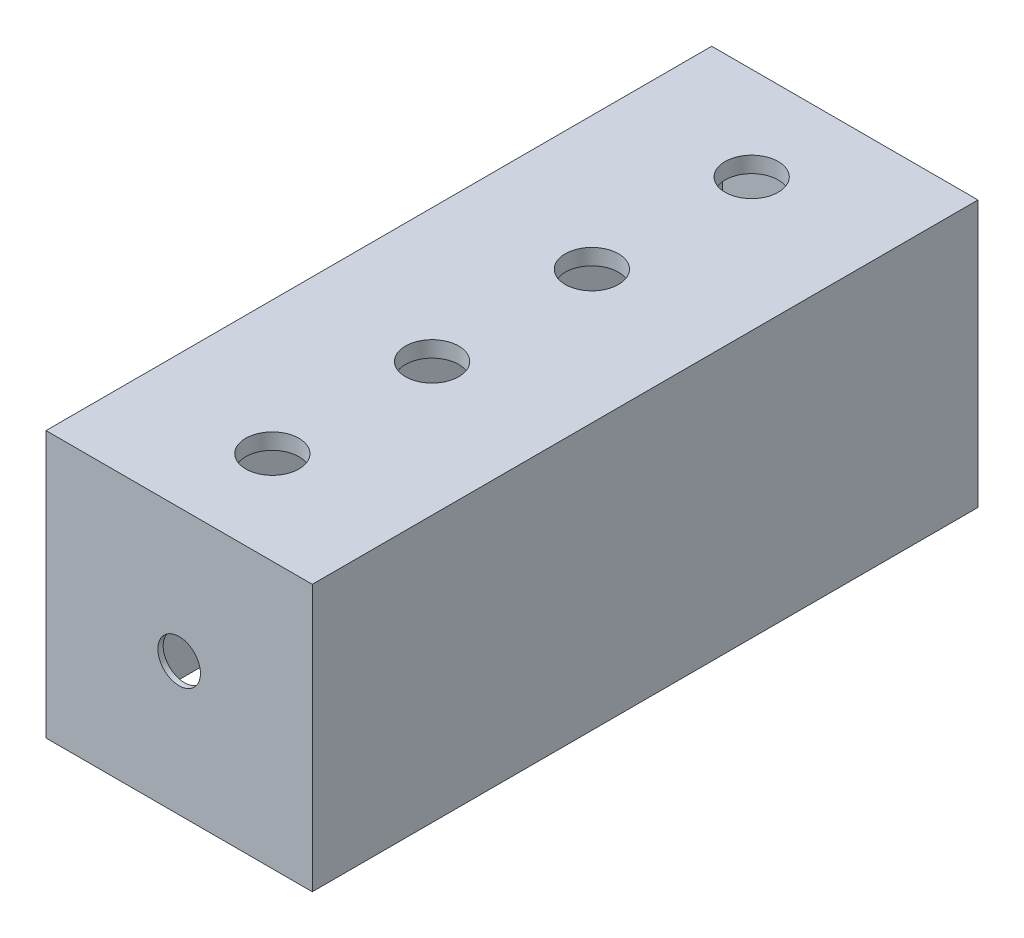
ISO-10303-21;
HEADER;
FILE_DESCRIPTION(('STEP AP214'),'2;1');
FILE_NAME('part.step','',(''),(''),'','','');
FILE_SCHEMA(('AUTOMOTIVE_DESIGN { 1 0 10303 214 1 1 1 1 }'));
ENDSEC;
DATA;
#1=APPLICATION_CONTEXT('core data for automotive mechanical design processes');
#2=APPLICATION_PROTOCOL_DEFINITION('international standard','automotive_design',2000,#1);
#3=PRODUCT_CONTEXT('',#1,'mechanical');
#4=PRODUCT('Part','Part','',(#3));
#5=PRODUCT_RELATED_PRODUCT_CATEGORY('part','',(#4));
#6=PRODUCT_DEFINITION_FORMATION('','',#4);
#7=PRODUCT_DEFINITION_CONTEXT('part definition',#1,'design');
#8=PRODUCT_DEFINITION('design','',#6,#7);
#9=PRODUCT_DEFINITION_SHAPE('','',#8);
#10=(LENGTH_UNIT() NAMED_UNIT(*) SI_UNIT(.MILLI.,.METRE.));
#11=(NAMED_UNIT(*) PLANE_ANGLE_UNIT() SI_UNIT($,.RADIAN.));
#12=(NAMED_UNIT(*) SI_UNIT($,.STERADIAN.) SOLID_ANGLE_UNIT());
#13=UNCERTAINTY_MEASURE_WITH_UNIT(LENGTH_MEASURE(1.E-05),#10,'distance_accuracy_value','');
#14=(GEOMETRIC_REPRESENTATION_CONTEXT(3) GLOBAL_UNCERTAINTY_ASSIGNED_CONTEXT((#13)) GLOBAL_UNIT_ASSIGNED_CONTEXT((#10,
#11,#12)) REPRESENTATION_CONTEXT('',''));
#15=CARTESIAN_POINT('',(0.,0.,0.));
#16=DIRECTION('',(0.,0.,1.));
#17=DIRECTION('',(1.,0.,0.));
#18=AXIS2_PLACEMENT_3D('',#15,#16,#17);
#19=CARTESIAN_POINT('',(0.,0.,125.));
#20=DIRECTION('',(0.,1.,0.));
#21=DIRECTION('',(0.,0.,1.));
#22=AXIS2_PLACEMENT_3D('',#19,#20,#21);
#23=PLANE('',#22);
#24=CARTESIAN_POINT('',(-1.59483084179832,0.,122.));
#25=DIRECTION('',(0.,-1.,0.));
#26=DIRECTION('',(0.,0.,-1.));
#27=AXIS2_PLACEMENT_3D('',#24,#25,#26);
#28=CIRCLE('',#27,1.);
#29=CARTESIAN_POINT('',(-1.59483084179832,0.,121.));
#30=VERTEX_POINT('',#29);
#31=EDGE_CURVE('E462',#30,#30,#28,.T.);
#32=ORIENTED_EDGE('',*,*,#31,.F.);
#33=EDGE_LOOP('',(#32));
#34=FACE_BOUND('',#33,.T.);
#35=CARTESIAN_POINT('',(-48.5156100207897,0.,3.));
#36=DIRECTION('',(0.,-1.,0.));
#37=DIRECTION('',(0.,0.,-1.));
#38=AXIS2_PLACEMENT_3D('',#35,#36,#37);
#39=CIRCLE('',#38,0.999999999999998);
#40=CARTESIAN_POINT('',(-48.5156100207897,0.,2.));
#41=VERTEX_POINT('',#40);
#42=EDGE_CURVE('E463',#41,#41,#39,.T.);
#43=ORIENTED_EDGE('',*,*,#42,.F.);
#44=EDGE_LOOP('',(#43));
#45=FACE_BOUND('',#44,.T.);
#46=CARTESIAN_POINT('',(-1.59483084179832,0.,3.));
#47=DIRECTION('',(0.,-1.,0.));
#48=DIRECTION('',(0.,0.,-1.));
#49=AXIS2_PLACEMENT_3D('',#46,#47,#48);
#50=CIRCLE('',#49,1.);
#51=CARTESIAN_POINT('',(-1.59483084179832,0.,2.));
#52=VERTEX_POINT('',#51);
#53=EDGE_CURVE('E473',#52,#52,#50,.T.);
#54=ORIENTED_EDGE('',*,*,#53,.F.);
#55=EDGE_LOOP('',(#54));
#56=FACE_BOUND('',#55,.T.);
#57=CARTESIAN_POINT('',(-48.5156100207897,0.,122.));
#58=DIRECTION('',(0.,-1.,0.));
#59=DIRECTION('',(0.,0.,-1.));
#60=AXIS2_PLACEMENT_3D('',#57,#58,#59);
#61=CIRCLE('',#60,0.999999999999998);
#62=CARTESIAN_POINT('',(-48.5156100207897,0.,121.));
#63=VERTEX_POINT('',#62);
#64=EDGE_CURVE('E142',#63,#63,#61,.T.);
#65=ORIENTED_EDGE('',*,*,#64,.F.);
#66=EDGE_LOOP('',(#65));
#67=FACE_BOUND('',#66,.T.);
#68=DIRECTION('',(1.,0.,0.));
#69=VECTOR('',#68,1.);
#70=CARTESIAN_POINT('',(0.,0.,0.));
#71=LINE('',#70,#69);
#72=CARTESIAN_POINT('',(-50.,0.,0.));
#73=VERTEX_POINT('',#72);
#74=CARTESIAN_POINT('',(0.,0.,0.));
#75=VERTEX_POINT('',#74);
#76=EDGE_CURVE('E84',#73,#75,#71,.T.);
#77=ORIENTED_EDGE('',*,*,#76,.T.);
#78=DIRECTION('',(0.,0.,-1.));
#79=VECTOR('',#78,1.);
#80=CARTESIAN_POINT('',(0.,0.,125.));
#81=LINE('',#80,#79);
#82=CARTESIAN_POINT('',(0.,0.,125.));
#83=VERTEX_POINT('',#82);
#84=EDGE_CURVE('E195',#83,#75,#81,.T.);
#85=ORIENTED_EDGE('',*,*,#84,.F.);
#86=DIRECTION('',(1.,0.,0.));
#87=VECTOR('',#86,1.);
#88=CARTESIAN_POINT('',(0.,0.,125.));
#89=LINE('',#88,#87);
#90=CARTESIAN_POINT('',(-50.,0.,125.));
#91=VERTEX_POINT('',#90);
#92=EDGE_CURVE('E63',#91,#83,#89,.T.);
#93=ORIENTED_EDGE('',*,*,#92,.F.);
#94=DIRECTION('',(0.,0.,-1.));
#95=VECTOR('',#94,1.);
#96=CARTESIAN_POINT('',(-50.,0.,125.));
#97=LINE('',#96,#95);
#98=EDGE_CURVE('E204',#91,#73,#97,.T.);
#99=ORIENTED_EDGE('',*,*,#98,.T.);
#100=EDGE_LOOP('',(#77,#85,#93,#99));
#101=FACE_BOUND('',#100,.T.);
#102=DIRECTION('',(0.,0.,-1.));
#103=VECTOR('',#102,1.);
#104=CARTESIAN_POINT('',(-3.,0.,0.));
#105=LINE('',#104,#103);
#106=CARTESIAN_POINT('',(-3.,0.,124.));
#107=VERTEX_POINT('',#106);
#108=CARTESIAN_POINT('',(-3.,0.,1.00000000000001));
#109=VERTEX_POINT('',#108);
#110=EDGE_CURVE('E54',#107,#109,#105,.T.);
#111=ORIENTED_EDGE('',*,*,#110,.T.);
#112=DIRECTION('',(1.,0.,0.));
#113=VECTOR('',#112,1.);
#114=CARTESIAN_POINT('',(0.,0.,1.00000000000001));
#115=LINE('',#114,#113);
#116=CARTESIAN_POINT('',(-47.,0.,1.));
#117=VERTEX_POINT('',#116);
#118=EDGE_CURVE('E136',#117,#109,#115,.T.);
#119=ORIENTED_EDGE('',*,*,#118,.F.);
#120=DIRECTION('',(0.,0.,-1.));
#121=VECTOR('',#120,1.);
#122=CARTESIAN_POINT('',(-47.,0.,0.));
#123=LINE('',#122,#121);
#124=CARTESIAN_POINT('',(-47.,0.,124.));
#125=VERTEX_POINT('',#124);
#126=EDGE_CURVE('E139',#125,#117,#123,.T.);
#127=ORIENTED_EDGE('',*,*,#126,.F.);
#128=DIRECTION('',(1.,0.,0.));
#129=VECTOR('',#128,1.);
#130=CARTESIAN_POINT('',(0.,0.,124.));
#131=LINE('',#130,#129);
#132=EDGE_CURVE('E159',#125,#107,#131,.T.);
#133=ORIENTED_EDGE('',*,*,#132,.T.);
#134=EDGE_LOOP('',(#111,#119,#127,#133));
#135=FACE_BOUND('',#134,.T.);
#136=ADVANCED_FACE('F37',(#34,#45,#56,#67,#101,#135),#23,.F.);
#137=CARTESIAN_POINT('',(-25.,-95.,107.5));
#138=DIRECTION('',(0.,1.,0.));
#139=DIRECTION('',(-1.,0.,0.));
#140=AXIS2_PLACEMENT_3D('',#137,#138,#139);
#141=CYLINDRICAL_SURFACE('',#140,5.);
#142=CARTESIAN_POINT('',(-25.,50.,107.5));
#143=DIRECTION('',(0.,1.,0.));
#144=DIRECTION('',(-1.,0.,0.));
#145=AXIS2_PLACEMENT_3D('',#142,#143,#144);
#146=CIRCLE('',#145,5.);
#147=CARTESIAN_POINT('',(-30.,50.,107.5));
#148=VERTEX_POINT('',#147);
#149=EDGE_CURVE('E176',#148,#148,#146,.T.);
#150=ORIENTED_EDGE('',*,*,#149,.T.);
#151=EDGE_LOOP('',(#150));
#152=FACE_BOUND('',#151,.T.);
#153=CARTESIAN_POINT('',(-25.,47.,107.5));
#154=DIRECTION('',(0.,-1.,0.));
#155=DIRECTION('',(0.,0.,-1.));
#156=AXIS2_PLACEMENT_3D('',#153,#154,#155);
#157=CIRCLE('',#156,5.);
#158=CARTESIAN_POINT('',(-25.,47.,102.5));
#159=VERTEX_POINT('',#158);
#160=EDGE_CURVE('E150',#159,#159,#157,.F.);
#161=ORIENTED_EDGE('',*,*,#160,.F.);
#162=EDGE_LOOP('',(#161));
#163=FACE_BOUND('',#162,.T.);
#164=ADVANCED_FACE('F230',(#152,#163),#141,.F.);
#165=CARTESIAN_POINT('',(-25.,-95.,77.5));
#166=DIRECTION('',(0.,1.,0.));
#167=DIRECTION('',(-1.,0.,0.));
#168=AXIS2_PLACEMENT_3D('',#165,#166,#167);
#169=CYLINDRICAL_SURFACE('',#168,5.);
#170=CARTESIAN_POINT('',(-25.,50.,77.5));
#171=DIRECTION('',(0.,1.,0.));
#172=DIRECTION('',(-1.,0.,0.));
#173=AXIS2_PLACEMENT_3D('',#170,#171,#172);
#174=CIRCLE('',#173,5.);
#175=CARTESIAN_POINT('',(-30.,50.,77.5));
#176=VERTEX_POINT('',#175);
#177=EDGE_CURVE('E184',#176,#176,#174,.T.);
#178=ORIENTED_EDGE('',*,*,#177,.T.);
#179=EDGE_LOOP('',(#178));
#180=FACE_BOUND('',#179,.T.);
#181=CARTESIAN_POINT('',(-25.,47.,77.5));
#182=DIRECTION('',(0.,-1.,0.));
#183=DIRECTION('',(0.,0.,-1.));
#184=AXIS2_PLACEMENT_3D('',#181,#182,#183);
#185=CIRCLE('',#184,5.);
#186=CARTESIAN_POINT('',(-25.,47.,72.5));
#187=VERTEX_POINT('',#186);
#188=EDGE_CURVE('E153',#187,#187,#185,.F.);
#189=ORIENTED_EDGE('',*,*,#188,.F.);
#190=EDGE_LOOP('',(#189));
#191=FACE_BOUND('',#190,.T.);
#192=ADVANCED_FACE('F236',(#180,#191),#169,.F.);
#193=CARTESIAN_POINT('',(-25.,-95.,47.5));
#194=DIRECTION('',(0.,1.,0.));
#195=DIRECTION('',(-1.,0.,0.));
#196=AXIS2_PLACEMENT_3D('',#193,#194,#195);
#197=CYLINDRICAL_SURFACE('',#196,5.);
#198=CARTESIAN_POINT('',(-25.,50.,47.5));
#199=DIRECTION('',(0.,1.,0.));
#200=DIRECTION('',(-1.,0.,0.));
#201=AXIS2_PLACEMENT_3D('',#198,#199,#200);
#202=CIRCLE('',#201,5.);
#203=CARTESIAN_POINT('',(-30.,50.,47.5));
#204=VERTEX_POINT('',#203);
#205=EDGE_CURVE('E181',#204,#204,#202,.T.);
#206=ORIENTED_EDGE('',*,*,#205,.T.);
#207=EDGE_LOOP('',(#206));
#208=FACE_BOUND('',#207,.T.);
#209=CARTESIAN_POINT('',(-25.,47.,47.5));
#210=DIRECTION('',(0.,-1.,0.));
#211=DIRECTION('',(0.,0.,-1.));
#212=AXIS2_PLACEMENT_3D('',#209,#210,#211);
#213=CIRCLE('',#212,5.);
#214=CARTESIAN_POINT('',(-25.,47.,42.5));
#215=VERTEX_POINT('',#214);
#216=EDGE_CURVE('E147',#215,#215,#213,.F.);
#217=ORIENTED_EDGE('',*,*,#216,.F.);
#218=EDGE_LOOP('',(#217));
#219=FACE_BOUND('',#218,.T.);
#220=ADVANCED_FACE('F287',(#208,#219),#197,.F.);
#221=CARTESIAN_POINT('',(-25.,-95.,17.5));
#222=DIRECTION('',(0.,1.,0.));
#223=DIRECTION('',(-1.,0.,0.));
#224=AXIS2_PLACEMENT_3D('',#221,#222,#223);
#225=CYLINDRICAL_SURFACE('',#224,5.);
#226=CARTESIAN_POINT('',(-25.,50.,17.5));
#227=DIRECTION('',(0.,1.,0.));
#228=DIRECTION('',(-1.,0.,0.));
#229=AXIS2_PLACEMENT_3D('',#226,#227,#228);
#230=CIRCLE('',#229,5.);
#231=CARTESIAN_POINT('',(-30.,50.,17.5));
#232=VERTEX_POINT('',#231);
#233=EDGE_CURVE('E177',#232,#232,#230,.T.);
#234=ORIENTED_EDGE('',*,*,#233,.T.);
#235=EDGE_LOOP('',(#234));
#236=FACE_BOUND('',#235,.T.);
#237=CARTESIAN_POINT('',(-25.,47.,17.5));
#238=DIRECTION('',(0.,-1.,0.));
#239=DIRECTION('',(0.,0.,-1.));
#240=AXIS2_PLACEMENT_3D('',#237,#238,#239);
#241=CIRCLE('',#240,5.);
#242=CARTESIAN_POINT('',(-25.,47.,12.5));
#243=VERTEX_POINT('',#242);
#244=EDGE_CURVE('E129',#243,#243,#241,.F.);
#245=ORIENTED_EDGE('',*,*,#244,.F.);
#246=EDGE_LOOP('',(#245));
#247=FACE_BOUND('',#246,.T.);
#248=ADVANCED_FACE('F283',(#236,#247),#225,.F.);
#249=CARTESIAN_POINT('',(-25.,25.,145.));
#250=DIRECTION('',(0.,0.,-1.));
#251=DIRECTION('',(-1.,0.,0.));
#252=AXIS2_PLACEMENT_3D('',#249,#250,#251);
#253=CYLINDRICAL_SURFACE('',#252,4.);
#254=CARTESIAN_POINT('',(-25.,25.,125.));
#255=DIRECTION('',(0.,0.,1.));
#256=DIRECTION('',(1.,0.,0.));
#257=AXIS2_PLACEMENT_3D('',#254,#255,#256);
#258=CIRCLE('',#257,4.);
#259=CARTESIAN_POINT('',(-21.,25.,125.));
#260=VERTEX_POINT('',#259);
#261=EDGE_CURVE('E173',#260,#260,#258,.T.);
#262=ORIENTED_EDGE('',*,*,#261,.T.);
#263=EDGE_LOOP('',(#262));
#264=FACE_BOUND('',#263,.T.);
#265=CARTESIAN_POINT('',(-25.,25.,124.));
#266=DIRECTION('',(0.,0.,-1.));
#267=DIRECTION('',(-1.,0.,0.));
#268=AXIS2_PLACEMENT_3D('',#265,#266,#267);
#269=CIRCLE('',#268,4.);
#270=CARTESIAN_POINT('',(-29.,25.,124.));
#271=VERTEX_POINT('',#270);
#272=EDGE_CURVE('E166',#271,#271,#269,.F.);
#273=ORIENTED_EDGE('',*,*,#272,.F.);
#274=EDGE_LOOP('',(#273));
#275=FACE_BOUND('',#274,.T.);
#276=ADVANCED_FACE('F226',(#264,#275),#253,.F.);
#277=CARTESIAN_POINT('',(0.,0.,125.));
#278=DIRECTION('',(-1.,0.,0.));
#279=DIRECTION('',(0.,-1.,0.));
#280=AXIS2_PLACEMENT_3D('',#277,#278,#279);
#281=PLANE('',#280);
#282=DIRECTION('',(0.,1.,0.));
#283=VECTOR('',#282,1.);
#284=CARTESIAN_POINT('',(0.,0.,0.));
#285=LINE('',#284,#283);
#286=CARTESIAN_POINT('',(0.,50.,0.));
#287=VERTEX_POINT('',#286);
#288=EDGE_CURVE('E180',#75,#287,#285,.T.);
#289=ORIENTED_EDGE('',*,*,#288,.T.);
#290=DIRECTION('',(0.,0.,-1.));
#291=VECTOR('',#290,1.);
#292=CARTESIAN_POINT('',(0.,50.,125.));
#293=LINE('',#292,#291);
#294=CARTESIAN_POINT('',(0.,50.,125.));
#295=VERTEX_POINT('',#294);
#296=EDGE_CURVE('E11',#295,#287,#293,.T.);
#297=ORIENTED_EDGE('',*,*,#296,.F.);
#298=DIRECTION('',(0.,1.,0.));
#299=VECTOR('',#298,1.);
#300=CARTESIAN_POINT('',(0.,0.,125.));
#301=LINE('',#300,#299);
#302=EDGE_CURVE('E189',#83,#295,#301,.T.);
#303=ORIENTED_EDGE('',*,*,#302,.F.);
#304=ORIENTED_EDGE('',*,*,#84,.T.);
#305=EDGE_LOOP('',(#289,#297,#303,#304));
#306=FACE_BOUND('',#305,.T.);
#307=ADVANCED_FACE('F39',(#306),#281,.F.);
#308=CARTESIAN_POINT('',(0.,50.,125.));
#309=DIRECTION('',(0.,-1.,0.));
#310=DIRECTION('',(1.,0.,0.));
#311=AXIS2_PLACEMENT_3D('',#308,#309,#310);
#312=PLANE('',#311);
#313=ORIENTED_EDGE('',*,*,#233,.F.);
#314=EDGE_LOOP('',(#313));
#315=FACE_BOUND('',#314,.T.);
#316=ORIENTED_EDGE('',*,*,#205,.F.);
#317=EDGE_LOOP('',(#316));
#318=FACE_BOUND('',#317,.T.);
#319=ORIENTED_EDGE('',*,*,#177,.F.);
#320=EDGE_LOOP('',(#319));
#321=FACE_BOUND('',#320,.T.);
#322=ORIENTED_EDGE('',*,*,#149,.F.);
#323=EDGE_LOOP('',(#322));
#324=FACE_BOUND('',#323,.T.);
#325=DIRECTION('',(-1.,0.,0.));
#326=VECTOR('',#325,1.);
#327=CARTESIAN_POINT('',(0.,50.,0.));
#328=LINE('',#327,#326);
#329=CARTESIAN_POINT('',(-50.,50.,0.));
#330=VERTEX_POINT('',#329);
#331=EDGE_CURVE('E198',#287,#330,#328,.T.);
#332=ORIENTED_EDGE('',*,*,#331,.T.);
#333=DIRECTION('',(0.,0.,-1.));
#334=VECTOR('',#333,1.);
#335=CARTESIAN_POINT('',(-50.,50.,125.));
#336=LINE('',#335,#334);
#337=CARTESIAN_POINT('',(-50.,50.,125.));
#338=VERTEX_POINT('',#337);
#339=EDGE_CURVE('E46',#338,#330,#336,.T.);
#340=ORIENTED_EDGE('',*,*,#339,.F.);
#341=DIRECTION('',(-1.,0.,0.));
#342=VECTOR('',#341,1.);
#343=CARTESIAN_POINT('',(0.,50.,125.));
#344=LINE('',#343,#342);
#345=EDGE_CURVE('E91',#295,#338,#344,.T.);
#346=ORIENTED_EDGE('',*,*,#345,.F.);
#347=ORIENTED_EDGE('',*,*,#296,.T.);
#348=EDGE_LOOP('',(#332,#340,#346,#347));
#349=FACE_BOUND('',#348,.T.);
#350=ADVANCED_FACE('F247',(#315,#318,#321,#324,#349),#312,.F.);
#351=CARTESIAN_POINT('',(-50.,0.,125.));
#352=DIRECTION('',(1.,0.,0.));
#353=DIRECTION('',(0.,0.,-1.));
#354=AXIS2_PLACEMENT_3D('',#351,#352,#353);
#355=PLANE('',#354);
#356=DIRECTION('',(0.,-1.,0.));
#357=VECTOR('',#356,1.);
#358=CARTESIAN_POINT('',(-50.,0.,0.));
#359=LINE('',#358,#357);
#360=EDGE_CURVE('E200',#330,#73,#359,.T.);
#361=ORIENTED_EDGE('',*,*,#360,.T.);
#362=ORIENTED_EDGE('',*,*,#98,.F.);
#363=DIRECTION('',(0.,-1.,0.));
#364=VECTOR('',#363,1.);
#365=CARTESIAN_POINT('',(-50.,0.,125.));
#366=LINE('',#365,#364);
#367=EDGE_CURVE('E192',#338,#91,#366,.T.);
#368=ORIENTED_EDGE('',*,*,#367,.F.);
#369=ORIENTED_EDGE('',*,*,#339,.T.);
#370=EDGE_LOOP('',(#361,#362,#368,#369));
#371=FACE_BOUND('',#370,.T.);
#372=ADVANCED_FACE('F244',(#371),#355,.F.);
#373=CARTESIAN_POINT('',(0.,0.,125.));
#374=DIRECTION('',(0.,0.,1.));
#375=DIRECTION('',(1.,0.,0.));
#376=AXIS2_PLACEMENT_3D('',#373,#374,#375);
#377=PLANE('',#376);
#378=ORIENTED_EDGE('',*,*,#261,.F.);
#379=EDGE_LOOP('',(#378));
#380=FACE_BOUND('',#379,.T.);
#381=ORIENTED_EDGE('',*,*,#302,.T.);
#382=ORIENTED_EDGE('',*,*,#345,.T.);
#383=ORIENTED_EDGE('',*,*,#367,.T.);
#384=ORIENTED_EDGE('',*,*,#92,.T.);
#385=EDGE_LOOP('',(#381,#382,#383,#384));
#386=FACE_BOUND('',#385,.T.);
#387=ADVANCED_FACE('F246',(#380,#386),#377,.T.);
#388=CARTESIAN_POINT('',(0.,0.,0.));
#389=DIRECTION('',(0.,0.,1.));
#390=DIRECTION('',(1.,0.,0.));
#391=AXIS2_PLACEMENT_3D('',#388,#389,#390);
#392=PLANE('',#391);
#393=CARTESIAN_POINT('',(-25.,25.,0.));
#394=DIRECTION('',(0.,0.,-1.));
#395=DIRECTION('',(-1.,0.,0.));
#396=AXIS2_PLACEMENT_3D('',#393,#394,#395);
#397=CIRCLE('',#396,4.);
#398=CARTESIAN_POINT('',(-29.,25.,0.));
#399=VERTEX_POINT('',#398);
#400=EDGE_CURVE('E170',#399,#399,#397,.T.);
#401=ORIENTED_EDGE('',*,*,#400,.F.);
#402=EDGE_LOOP('',(#401));
#403=FACE_BOUND('',#402,.T.);
#404=ORIENTED_EDGE('',*,*,#288,.F.);
#405=ORIENTED_EDGE('',*,*,#76,.F.);
#406=ORIENTED_EDGE('',*,*,#360,.F.);
#407=ORIENTED_EDGE('',*,*,#331,.F.);
#408=EDGE_LOOP('',(#404,#405,#406,#407));
#409=FACE_BOUND('',#408,.T.);
#410=ADVANCED_FACE('F224',(#403,#409),#392,.F.);
#411=CARTESIAN_POINT('',(-25.,25.,1.));
#412=DIRECTION('',(0.,0.,-1.));
#413=DIRECTION('',(-1.,0.,0.));
#414=AXIS2_PLACEMENT_3D('',#411,#412,#413);
#415=CIRCLE('',#414,4.);
#416=CARTESIAN_POINT('',(-29.,25.,1.));
#417=VERTEX_POINT('',#416);
#418=EDGE_CURVE('E41',#417,#417,#415,.F.);
#419=ORIENTED_EDGE('',*,*,#418,.T.);
#420=EDGE_LOOP('',(#419));
#421=FACE_BOUND('',#420,.T.);
#422=ORIENTED_EDGE('',*,*,#400,.T.);
#423=EDGE_LOOP('',(#422));
#424=FACE_BOUND('',#423,.T.);
#425=ADVANCED_FACE('F212',(#421,#424),#253,.F.);
#426=CARTESIAN_POINT('',(0.,47.,1.00000000000001));
#427=DIRECTION('',(0.,0.,-1.));
#428=DIRECTION('',(-1.,0.,0.));
#429=AXIS2_PLACEMENT_3D('',#426,#427,#428);
#430=PLANE('',#429);
#431=ORIENTED_EDGE('',*,*,#118,.T.);
#432=DIRECTION('',(0.,-1.,0.));
#433=VECTOR('',#432,1.);
#434=CARTESIAN_POINT('',(-3.,47.,1.00000000000001));
#435=LINE('',#434,#433);
#436=CARTESIAN_POINT('',(-3.,47.,1.00000000000001));
#437=VERTEX_POINT('',#436);
#438=EDGE_CURVE('E164',#437,#109,#435,.T.);
#439=ORIENTED_EDGE('',*,*,#438,.F.);
#440=DIRECTION('',(1.,0.,0.));
#441=VECTOR('',#440,1.);
#442=CARTESIAN_POINT('',(0.,47.,1.00000000000001));
#443=LINE('',#442,#441);
#444=CARTESIAN_POINT('',(-47.,47.,1.));
#445=VERTEX_POINT('',#444);
#446=EDGE_CURVE('E135',#445,#437,#443,.T.);
#447=ORIENTED_EDGE('',*,*,#446,.F.);
#448=DIRECTION('',(0.,-1.,0.));
#449=VECTOR('',#448,1.);
#450=CARTESIAN_POINT('',(-47.,47.,1.));
#451=LINE('',#450,#449);
#452=EDGE_CURVE('E167',#445,#117,#451,.T.);
#453=ORIENTED_EDGE('',*,*,#452,.T.);
#454=EDGE_LOOP('',(#431,#439,#447,#453));
#455=FACE_BOUND('',#454,.T.);
#456=ORIENTED_EDGE('',*,*,#418,.F.);
#457=EDGE_LOOP('',(#456));
#458=FACE_BOUND('',#457,.T.);
#459=ADVANCED_FACE('F215',(#455,#458),#430,.F.);
#460=CARTESIAN_POINT('',(0.,47.,124.));
#461=DIRECTION('',(0.,0.,-1.));
#462=DIRECTION('',(-1.,0.,0.));
#463=AXIS2_PLACEMENT_3D('',#460,#461,#462);
#464=PLANE('',#463);
#465=ORIENTED_EDGE('',*,*,#132,.F.);
#466=DIRECTION('',(0.,-1.,0.));
#467=VECTOR('',#466,1.);
#468=CARTESIAN_POINT('',(-47.,47.,124.));
#469=LINE('',#468,#467);
#470=CARTESIAN_POINT('',(-47.,47.,124.));
#471=VERTEX_POINT('',#470);
#472=EDGE_CURVE('E119',#471,#125,#469,.T.);
#473=ORIENTED_EDGE('',*,*,#472,.F.);
#474=DIRECTION('',(1.,0.,0.));
#475=VECTOR('',#474,1.);
#476=CARTESIAN_POINT('',(0.,47.,124.));
#477=LINE('',#476,#475);
#478=CARTESIAN_POINT('',(-3.,47.,124.));
#479=VERTEX_POINT('',#478);
#480=EDGE_CURVE('E113',#471,#479,#477,.T.);
#481=ORIENTED_EDGE('',*,*,#480,.T.);
#482=DIRECTION('',(0.,-1.,0.));
#483=VECTOR('',#482,1.);
#484=CARTESIAN_POINT('',(-3.,47.,124.));
#485=LINE('',#484,#483);
#486=EDGE_CURVE('E117',#479,#107,#485,.T.);
#487=ORIENTED_EDGE('',*,*,#486,.T.);
#488=EDGE_LOOP('',(#465,#473,#481,#487));
#489=FACE_BOUND('',#488,.T.);
#490=ORIENTED_EDGE('',*,*,#272,.T.);
#491=EDGE_LOOP('',(#490));
#492=FACE_BOUND('',#491,.T.);
#493=ADVANCED_FACE('F115',(#489,#492),#464,.T.);
#494=CARTESIAN_POINT('',(-3.,47.,0.));
#495=DIRECTION('',(-1.,0.,0.));
#496=DIRECTION('',(0.,0.,1.));
#497=AXIS2_PLACEMENT_3D('',#494,#495,#496);
#498=PLANE('',#497);
#499=ORIENTED_EDGE('',*,*,#110,.F.);
#500=ORIENTED_EDGE('',*,*,#486,.F.);
#501=DIRECTION('',(0.,0.,-1.));
#502=VECTOR('',#501,1.);
#503=CARTESIAN_POINT('',(-3.,47.,0.));
#504=LINE('',#503,#502);
#505=EDGE_CURVE('E125',#479,#437,#504,.T.);
#506=ORIENTED_EDGE('',*,*,#505,.T.);
#507=ORIENTED_EDGE('',*,*,#438,.T.);
#508=EDGE_LOOP('',(#499,#500,#506,#507));
#509=FACE_BOUND('',#508,.T.);
#510=ADVANCED_FACE('F127',(#509),#498,.T.);
#511=CARTESIAN_POINT('',(-47.,47.,0.));
#512=DIRECTION('',(-1.,0.,0.));
#513=DIRECTION('',(0.,0.,1.));
#514=AXIS2_PLACEMENT_3D('',#511,#512,#513);
#515=PLANE('',#514);
#516=ORIENTED_EDGE('',*,*,#126,.T.);
#517=ORIENTED_EDGE('',*,*,#452,.F.);
#518=DIRECTION('',(0.,0.,-1.));
#519=VECTOR('',#518,1.);
#520=CARTESIAN_POINT('',(-47.,47.,0.));
#521=LINE('',#520,#519);
#522=EDGE_CURVE('E124',#471,#445,#521,.T.);
#523=ORIENTED_EDGE('',*,*,#522,.F.);
#524=ORIENTED_EDGE('',*,*,#472,.T.);
#525=EDGE_LOOP('',(#516,#517,#523,#524));
#526=FACE_BOUND('',#525,.T.);
#527=ADVANCED_FACE('F273',(#526),#515,.F.);
#528=CARTESIAN_POINT('',(0.,47.,0.));
#529=DIRECTION('',(0.,-1.,0.));
#530=DIRECTION('',(0.,0.,-1.));
#531=AXIS2_PLACEMENT_3D('',#528,#529,#530);
#532=PLANE('',#531);
#533=ORIENTED_EDGE('',*,*,#505,.F.);
#534=ORIENTED_EDGE('',*,*,#480,.F.);
#535=ORIENTED_EDGE('',*,*,#522,.T.);
#536=ORIENTED_EDGE('',*,*,#446,.T.);
#537=EDGE_LOOP('',(#533,#534,#535,#536));
#538=FACE_BOUND('',#537,.T.);
#539=ORIENTED_EDGE('',*,*,#216,.T.);
#540=EDGE_LOOP('',(#539));
#541=FACE_BOUND('',#540,.T.);
#542=ORIENTED_EDGE('',*,*,#160,.T.);
#543=EDGE_LOOP('',(#542));
#544=FACE_BOUND('',#543,.T.);
#545=ORIENTED_EDGE('',*,*,#188,.T.);
#546=EDGE_LOOP('',(#545));
#547=FACE_BOUND('',#546,.T.);
#548=ORIENTED_EDGE('',*,*,#244,.T.);
#549=EDGE_LOOP('',(#548));
#550=FACE_BOUND('',#549,.T.);
#551=ADVANCED_FACE('F132',(#538,#541,#544,#547,#550),#532,.T.);
#552=CARTESIAN_POINT('',(-48.5156100207897,5.,122.));
#553=DIRECTION('',(0.,-1.,0.));
#554=DIRECTION('',(0.,0.,-1.));
#555=AXIS2_PLACEMENT_3D('',#552,#553,#554);
#556=CYLINDRICAL_SURFACE('',#555,0.999999999999998);
#557=CARTESIAN_POINT('',(-48.5156100207897,5.,122.));
#558=DIRECTION('',(0.,-1.,0.));
#559=DIRECTION('',(0.,0.,-1.));
#560=AXIS2_PLACEMENT_3D('',#557,#558,#559);
#561=CIRCLE('',#560,0.999999999999998);
#562=CARTESIAN_POINT('',(-48.5156100207897,5.,121.));
#563=VERTEX_POINT('',#562);
#564=EDGE_CURVE('E160',#563,#563,#561,.T.);
#565=ORIENTED_EDGE('',*,*,#564,.F.);
#566=EDGE_LOOP('',(#565));
#567=FACE_BOUND('',#566,.T.);
#568=ORIENTED_EDGE('',*,*,#64,.T.);
#569=EDGE_LOOP('',(#568));
#570=FACE_BOUND('',#569,.T.);
#571=ADVANCED_FACE('F279',(#567,#570),#556,.F.);
#572=CARTESIAN_POINT('',(-48.5156100207897,5.,122.));
#573=DIRECTION('',(0.,-1.,0.));
#574=DIRECTION('',(0.,0.,-1.));
#575=AXIS2_PLACEMENT_3D('',#572,#573,#574);
#576=PLANE('',#575);
#577=ORIENTED_EDGE('',*,*,#564,.T.);
#578=EDGE_LOOP('',(#577));
#579=FACE_BOUND('',#578,.T.);
#580=ADVANCED_FACE('F361',(#579),#576,.T.);
#581=CARTESIAN_POINT('',(-1.59483084179832,5.,3.));
#582=DIRECTION('',(0.,-1.,0.));
#583=DIRECTION('',(0.,0.,-1.));
#584=AXIS2_PLACEMENT_3D('',#581,#582,#583);
#585=CYLINDRICAL_SURFACE('',#584,1.);
#586=CARTESIAN_POINT('',(-1.59483084179832,5.,3.));
#587=DIRECTION('',(0.,-1.,0.));
#588=DIRECTION('',(0.,0.,-1.));
#589=AXIS2_PLACEMENT_3D('',#586,#587,#588);
#590=CIRCLE('',#589,1.);
#591=CARTESIAN_POINT('',(-1.59483084179832,5.,2.));
#592=VERTEX_POINT('',#591);
#593=EDGE_CURVE('E482',#592,#592,#590,.T.);
#594=ORIENTED_EDGE('',*,*,#593,.F.);
#595=EDGE_LOOP('',(#594));
#596=FACE_BOUND('',#595,.T.);
#597=ORIENTED_EDGE('',*,*,#53,.T.);
#598=EDGE_LOOP('',(#597));
#599=FACE_BOUND('',#598,.T.);
#600=ADVANCED_FACE('F372',(#596,#599),#585,.F.);
#601=CARTESIAN_POINT('',(-1.59483084179832,5.,3.));
#602=DIRECTION('',(0.,-1.,0.));
#603=DIRECTION('',(0.,0.,-1.));
#604=AXIS2_PLACEMENT_3D('',#601,#602,#603);
#605=PLANE('',#604);
#606=ORIENTED_EDGE('',*,*,#593,.T.);
#607=EDGE_LOOP('',(#606));
#608=FACE_BOUND('',#607,.T.);
#609=ADVANCED_FACE('F383',(#608),#605,.T.);
#610=CARTESIAN_POINT('',(-48.5156100207897,5.,3.));
#611=DIRECTION('',(0.,-1.,0.));
#612=DIRECTION('',(0.,0.,-1.));
#613=AXIS2_PLACEMENT_3D('',#610,#611,#612);
#614=CYLINDRICAL_SURFACE('',#613,0.999999999999998);
#615=CARTESIAN_POINT('',(-48.5156100207897,5.,3.));
#616=DIRECTION('',(0.,-1.,0.));
#617=DIRECTION('',(0.,0.,-1.));
#618=AXIS2_PLACEMENT_3D('',#615,#616,#617);
#619=CIRCLE('',#618,0.999999999999998);
#620=CARTESIAN_POINT('',(-48.5156100207897,5.,2.));
#621=VERTEX_POINT('',#620);
#622=EDGE_CURVE('E468',#621,#621,#619,.T.);
#623=ORIENTED_EDGE('',*,*,#622,.F.);
#624=EDGE_LOOP('',(#623));
#625=FACE_BOUND('',#624,.T.);
#626=ORIENTED_EDGE('',*,*,#42,.T.);
#627=EDGE_LOOP('',(#626));
#628=FACE_BOUND('',#627,.T.);
#629=ADVANCED_FACE('F394',(#625,#628),#614,.F.);
#630=CARTESIAN_POINT('',(-48.5156100207897,5.,3.));
#631=DIRECTION('',(0.,-1.,0.));
#632=DIRECTION('',(0.,0.,-1.));
#633=AXIS2_PLACEMENT_3D('',#630,#631,#632);
#634=PLANE('',#633);
#635=ORIENTED_EDGE('',*,*,#622,.T.);
#636=EDGE_LOOP('',(#635));
#637=FACE_BOUND('',#636,.T.);
#638=ADVANCED_FACE('F405',(#637),#634,.T.);
#639=CARTESIAN_POINT('',(-1.59483084179832,5.,122.));
#640=DIRECTION('',(0.,-1.,0.));
#641=DIRECTION('',(0.,0.,-1.));
#642=AXIS2_PLACEMENT_3D('',#639,#640,#641);
#643=CYLINDRICAL_SURFACE('',#642,1.);
#644=CARTESIAN_POINT('',(-1.59483084179832,5.,122.));
#645=DIRECTION('',(0.,-1.,0.));
#646=DIRECTION('',(0.,0.,-1.));
#647=AXIS2_PLACEMENT_3D('',#644,#645,#646);
#648=CIRCLE('',#647,1.);
#649=CARTESIAN_POINT('',(-1.59483084179832,5.,121.));
#650=VERTEX_POINT('',#649);
#651=EDGE_CURVE('E461',#650,#650,#648,.T.);
#652=ORIENTED_EDGE('',*,*,#651,.F.);
#653=EDGE_LOOP('',(#652));
#654=FACE_BOUND('',#653,.T.);
#655=ORIENTED_EDGE('',*,*,#31,.T.);
#656=EDGE_LOOP('',(#655));
#657=FACE_BOUND('',#656,.T.);
#658=ADVANCED_FACE('F416',(#654,#657),#643,.F.);
#659=CARTESIAN_POINT('',(-1.59483084179832,5.,122.));
#660=DIRECTION('',(0.,-1.,0.));
#661=DIRECTION('',(0.,0.,-1.));
#662=AXIS2_PLACEMENT_3D('',#659,#660,#661);
#663=PLANE('',#662);
#664=ORIENTED_EDGE('',*,*,#651,.T.);
#665=EDGE_LOOP('',(#664));
#666=FACE_BOUND('',#665,.T.);
#667=ADVANCED_FACE('F427',(#666),#663,.T.);
#668=CLOSED_SHELL('',(#136,#164,#192,#220,#248,#276,#307,#350,#372,#387,#410,#425,#459,#493,
#510,#527,#551,#571,#580,#600,#609,#629,#638,#658,#667));
#669=MANIFOLD_SOLID_BREP('B2',#668);
#670=ADVANCED_BREP_SHAPE_REPRESENTATION('',(#18,#669),#14);
#671=SHAPE_DEFINITION_REPRESENTATION(#9,#670);
ENDSEC;
END-ISO-10303-21;
